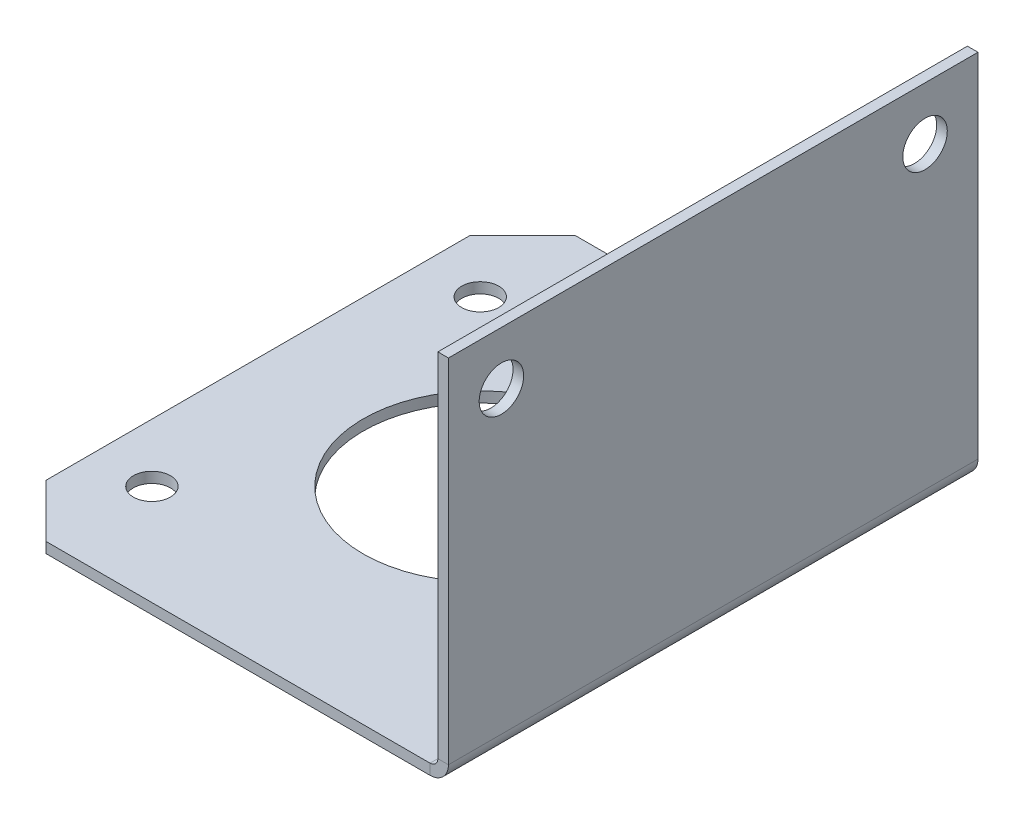
ISO-10303-21;
HEADER;
FILE_DESCRIPTION(('STEP AP214'),'2;1');
FILE_NAME('part.step','',(''),(''),'','','');
FILE_SCHEMA(('AUTOMOTIVE_DESIGN { 1 0 10303 214 1 1 1 1 }'));
ENDSEC;
DATA;
#1=APPLICATION_CONTEXT('core data for automotive mechanical design processes');
#2=APPLICATION_PROTOCOL_DEFINITION('international standard','automotive_design',2000,#1);
#3=PRODUCT_CONTEXT('',#1,'mechanical');
#4=PRODUCT('Part','Part','',(#3));
#5=PRODUCT_RELATED_PRODUCT_CATEGORY('part','',(#4));
#6=PRODUCT_DEFINITION_FORMATION('','',#4);
#7=PRODUCT_DEFINITION_CONTEXT('part definition',#1,'design');
#8=PRODUCT_DEFINITION('design','',#6,#7);
#9=PRODUCT_DEFINITION_SHAPE('','',#8);
#10=(LENGTH_UNIT() NAMED_UNIT(*) SI_UNIT(.MILLI.,.METRE.));
#11=(NAMED_UNIT(*) PLANE_ANGLE_UNIT() SI_UNIT($,.RADIAN.));
#12=(NAMED_UNIT(*) SI_UNIT($,.STERADIAN.) SOLID_ANGLE_UNIT());
#13=UNCERTAINTY_MEASURE_WITH_UNIT(LENGTH_MEASURE(1.E-05),#10,'distance_accuracy_value','');
#14=(GEOMETRIC_REPRESENTATION_CONTEXT(3) GLOBAL_UNCERTAINTY_ASSIGNED_CONTEXT((#13)) GLOBAL_UNIT_ASSIGNED_CONTEXT((#10,
#11,#12)) REPRESENTATION_CONTEXT('',''));
#15=CARTESIAN_POINT('',(0.,0.,0.));
#16=DIRECTION('',(0.,0.,1.));
#17=DIRECTION('',(1.,0.,0.));
#18=AXIS2_PLACEMENT_3D('',#15,#16,#17);
#19=CARTESIAN_POINT('',(0.,-1.,-25.));
#20=DIRECTION('',(0.,0.,-1.));
#21=DIRECTION('',(-1.,0.,0.));
#22=AXIS2_PLACEMENT_3D('',#19,#20,#21);
#23=PLANE('',#22);
#24=DIRECTION('',(-1.,0.,0.));
#25=VECTOR('',#24,1.);
#26=CARTESIAN_POINT('',(0.,-1.,-25.));
#27=LINE('',#26,#25);
#28=CARTESIAN_POINT('',(41.2634,-1.,-25.));
#29=VERTEX_POINT('',#28);
#30=CARTESIAN_POINT('',(5.,-1.,-25.));
#31=VERTEX_POINT('',#30);
#32=EDGE_CURVE('E242',#29,#31,#27,.T.);
#33=ORIENTED_EDGE('',*,*,#32,.T.);
#34=DIRECTION('',(0.,1.,0.));
#35=VECTOR('',#34,1.);
#36=CARTESIAN_POINT('',(5.,-1.,-25.));
#37=LINE('',#36,#35);
#38=CARTESIAN_POINT('',(5.,0.,-25.));
#39=VERTEX_POINT('',#38);
#40=EDGE_CURVE('E13',#31,#39,#37,.T.);
#41=ORIENTED_EDGE('',*,*,#40,.T.);
#42=DIRECTION('',(-1.,0.,0.));
#43=VECTOR('',#42,1.);
#44=CARTESIAN_POINT('',(0.,0.,-25.));
#45=LINE('',#44,#43);
#46=CARTESIAN_POINT('',(41.2634,0.,-25.));
#47=VERTEX_POINT('',#46);
#48=EDGE_CURVE('E240',#47,#39,#45,.T.);
#49=ORIENTED_EDGE('',*,*,#48,.F.);
#50=DIRECTION('',(0.,-1.,0.));
#51=VECTOR('',#50,1.);
#52=CARTESIAN_POINT('',(41.2634,0.,-25.));
#53=LINE('',#52,#51);
#54=EDGE_CURVE('E188',#47,#29,#53,.T.);
#55=ORIENTED_EDGE('',*,*,#54,.T.);
#56=EDGE_LOOP('',(#33,#41,#49,#55));
#57=FACE_BOUND('',#56,.T.);
#58=ADVANCED_FACE('F59',(#57),#23,.T.);
#59=CARTESIAN_POINT('',(0.,-1.,0.));
#60=DIRECTION('',(0.,-1.,0.));
#61=DIRECTION('',(0.,0.,-1.));
#62=AXIS2_PLACEMENT_3D('',#59,#60,#61);
#63=PLANE('',#62);
#64=CARTESIAN_POINT('',(5.5,-1.,-15.5));
#65=DIRECTION('',(0.,1.,0.));
#66=DIRECTION('',(0.,0.,1.));
#67=AXIS2_PLACEMENT_3D('',#64,#65,#66);
#68=CIRCLE('',#67,1.75);
#69=CARTESIAN_POINT('',(5.5,-1.,-13.75));
#70=VERTEX_POINT('',#69);
#71=EDGE_CURVE('E206',#70,#70,#68,.T.);
#72=ORIENTED_EDGE('',*,*,#71,.T.);
#73=EDGE_LOOP('',(#72));
#74=FACE_BOUND('',#73,.T.);
#75=CARTESIAN_POINT('',(36.5,-1.,-15.5));
#76=DIRECTION('',(0.,1.,0.));
#77=DIRECTION('',(0.,0.,1.));
#78=AXIS2_PLACEMENT_3D('',#75,#76,#77);
#79=CIRCLE('',#78,1.75);
#80=CARTESIAN_POINT('',(36.5,-1.,-13.75));
#81=VERTEX_POINT('',#80);
#82=EDGE_CURVE('E213',#81,#81,#79,.T.);
#83=ORIENTED_EDGE('',*,*,#82,.T.);
#84=EDGE_LOOP('',(#83));
#85=FACE_BOUND('',#84,.T.);
#86=CARTESIAN_POINT('',(36.5,-1.,15.5));
#87=DIRECTION('',(0.,1.,0.));
#88=DIRECTION('',(0.,0.,1.));
#89=AXIS2_PLACEMENT_3D('',#86,#87,#88);
#90=CIRCLE('',#89,1.75);
#91=CARTESIAN_POINT('',(36.5,-1.,17.25));
#92=VERTEX_POINT('',#91);
#93=EDGE_CURVE('E219',#92,#92,#90,.T.);
#94=ORIENTED_EDGE('',*,*,#93,.T.);
#95=EDGE_LOOP('',(#94));
#96=FACE_BOUND('',#95,.T.);
#97=CARTESIAN_POINT('',(5.5,-1.,15.5));
#98=DIRECTION('',(0.,1.,0.));
#99=DIRECTION('',(0.,0.,1.));
#100=AXIS2_PLACEMENT_3D('',#97,#98,#99);
#101=CIRCLE('',#100,1.75);
#102=CARTESIAN_POINT('',(5.5,-1.,17.25));
#103=VERTEX_POINT('',#102);
#104=EDGE_CURVE('E225',#103,#103,#101,.T.);
#105=ORIENTED_EDGE('',*,*,#104,.T.);
#106=EDGE_LOOP('',(#105));
#107=FACE_BOUND('',#106,.T.);
#108=CARTESIAN_POINT('',(21.,-1.,0.));
#109=DIRECTION('',(0.,1.,0.));
#110=DIRECTION('',(0.,0.,1.));
#111=AXIS2_PLACEMENT_3D('',#108,#109,#110);
#112=CIRCLE('',#111,11.05);
#113=CARTESIAN_POINT('',(21.,-1.,11.05));
#114=VERTEX_POINT('',#113);
#115=EDGE_CURVE('E230',#114,#114,#112,.T.);
#116=ORIENTED_EDGE('',*,*,#115,.T.);
#117=EDGE_LOOP('',(#116));
#118=FACE_BOUND('',#117,.T.);
#119=DIRECTION('',(1.,0.,0.));
#120=VECTOR('',#119,1.);
#121=CARTESIAN_POINT('',(0.,-1.,25.));
#122=LINE('',#121,#120);
#123=CARTESIAN_POINT('',(5.00000000000002,-1.,25.));
#124=VERTEX_POINT('',#123);
#125=CARTESIAN_POINT('',(41.2634,-1.,25.));
#126=VERTEX_POINT('',#125);
#127=EDGE_CURVE('E239',#124,#126,#122,.T.);
#128=ORIENTED_EDGE('',*,*,#127,.F.);
#129=DIRECTION('',(0.707106781186549,0.,0.707106781186546));
#130=VECTOR('',#129,1.);
#131=CARTESIAN_POINT('',(-9.99999999999999,-1.,10.));
#132=LINE('',#131,#130);
#133=CARTESIAN_POINT('',(0.,-1.,20.));
#134=VERTEX_POINT('',#133);
#135=EDGE_CURVE('E67',#124,#134,#132,.F.);
#136=ORIENTED_EDGE('',*,*,#135,.T.);
#137=DIRECTION('',(0.,0.,1.));
#138=VECTOR('',#137,1.);
#139=CARTESIAN_POINT('',(0.,-1.,25.));
#140=LINE('',#139,#138);
#141=CARTESIAN_POINT('',(0.,-1.,-20.));
#142=VERTEX_POINT('',#141);
#143=EDGE_CURVE('E236',#142,#134,#140,.T.);
#144=ORIENTED_EDGE('',*,*,#143,.F.);
#145=DIRECTION('',(-0.707106781186546,0.,0.707106781186549));
#146=VECTOR('',#145,1.);
#147=CARTESIAN_POINT('',(-9.99999999999999,-1.,-9.99999999999996));
#148=LINE('',#147,#146);
#149=EDGE_CURVE('E74',#142,#31,#148,.F.);
#150=ORIENTED_EDGE('',*,*,#149,.T.);
#151=ORIENTED_EDGE('',*,*,#32,.F.);
#152=DIRECTION('',(0.,0.,-1.));
#153=VECTOR('',#152,1.);
#154=CARTESIAN_POINT('',(41.2634,-1.,-25.));
#155=LINE('',#154,#153);
#156=EDGE_CURVE('E181',#29,#126,#155,.F.);
#157=ORIENTED_EDGE('',*,*,#156,.T.);
#158=EDGE_LOOP('',(#128,#136,#144,#150,#151,#157));
#159=FACE_BOUND('',#158,.T.);
#160=ADVANCED_FACE('F261',(#74,#85,#96,#107,#118,#159),#63,.T.);
#161=CARTESIAN_POINT('',(0.,0.,0.));
#162=DIRECTION('',(0.,-1.,0.));
#163=DIRECTION('',(0.,0.,-1.));
#164=AXIS2_PLACEMENT_3D('',#161,#162,#163);
#165=PLANE('',#164);
#166=CARTESIAN_POINT('',(21.,0.,0.));
#167=DIRECTION('',(0.,1.,0.));
#168=DIRECTION('',(0.,0.,1.));
#169=AXIS2_PLACEMENT_3D('',#166,#167,#168);
#170=CIRCLE('',#169,11.05);
#171=CARTESIAN_POINT('',(21.,0.,11.05));
#172=VERTEX_POINT('',#171);
#173=EDGE_CURVE('E209',#172,#172,#170,.T.);
#174=ORIENTED_EDGE('',*,*,#173,.F.);
#175=EDGE_LOOP('',(#174));
#176=FACE_BOUND('',#175,.T.);
#177=CARTESIAN_POINT('',(5.5,0.,15.5));
#178=DIRECTION('',(0.,1.,0.));
#179=DIRECTION('',(0.,0.,1.));
#180=AXIS2_PLACEMENT_3D('',#177,#178,#179);
#181=CIRCLE('',#180,1.75);
#182=CARTESIAN_POINT('',(5.5,0.,17.25));
#183=VERTEX_POINT('',#182);
#184=EDGE_CURVE('E203',#183,#183,#181,.T.);
#185=ORIENTED_EDGE('',*,*,#184,.F.);
#186=EDGE_LOOP('',(#185));
#187=FACE_BOUND('',#186,.T.);
#188=CARTESIAN_POINT('',(36.5,0.,15.5));
#189=DIRECTION('',(0.,1.,0.));
#190=DIRECTION('',(0.,0.,1.));
#191=AXIS2_PLACEMENT_3D('',#188,#189,#190);
#192=CIRCLE('',#191,1.75);
#193=CARTESIAN_POINT('',(36.5,0.,17.25));
#194=VERTEX_POINT('',#193);
#195=EDGE_CURVE('E222',#194,#194,#192,.T.);
#196=ORIENTED_EDGE('',*,*,#195,.F.);
#197=EDGE_LOOP('',(#196));
#198=FACE_BOUND('',#197,.T.);
#199=CARTESIAN_POINT('',(36.5,0.,-15.5));
#200=DIRECTION('',(0.,1.,0.));
#201=DIRECTION('',(0.,0.,1.));
#202=AXIS2_PLACEMENT_3D('',#199,#200,#201);
#203=CIRCLE('',#202,1.75);
#204=CARTESIAN_POINT('',(36.5,0.,-13.75));
#205=VERTEX_POINT('',#204);
#206=EDGE_CURVE('E216',#205,#205,#203,.T.);
#207=ORIENTED_EDGE('',*,*,#206,.F.);
#208=EDGE_LOOP('',(#207));
#209=FACE_BOUND('',#208,.T.);
#210=CARTESIAN_POINT('',(5.5,0.,-15.5));
#211=DIRECTION('',(0.,1.,0.));
#212=DIRECTION('',(0.,0.,1.));
#213=AXIS2_PLACEMENT_3D('',#210,#211,#212);
#214=CIRCLE('',#213,1.75);
#215=CARTESIAN_POINT('',(5.5,0.,-13.75));
#216=VERTEX_POINT('',#215);
#217=EDGE_CURVE('E210',#216,#216,#214,.T.);
#218=ORIENTED_EDGE('',*,*,#217,.F.);
#219=EDGE_LOOP('',(#218));
#220=FACE_BOUND('',#219,.T.);
#221=DIRECTION('',(0.,0.,1.));
#222=VECTOR('',#221,1.);
#223=CARTESIAN_POINT('',(0.,0.,25.));
#224=LINE('',#223,#222);
#225=CARTESIAN_POINT('',(0.,0.,-20.));
#226=VERTEX_POINT('',#225);
#227=CARTESIAN_POINT('',(0.,0.,20.));
#228=VERTEX_POINT('',#227);
#229=EDGE_CURVE('E233',#226,#228,#224,.T.);
#230=ORIENTED_EDGE('',*,*,#229,.T.);
#231=DIRECTION('',(-0.707106781186549,0.,-0.707106781186546));
#232=VECTOR('',#231,1.);
#233=CARTESIAN_POINT('',(0.,0.,20.));
#234=LINE('',#233,#232);
#235=CARTESIAN_POINT('',(5.00000000000002,0.,25.));
#236=VERTEX_POINT('',#235);
#237=EDGE_CURVE('E257',#228,#236,#234,.F.);
#238=ORIENTED_EDGE('',*,*,#237,.T.);
#239=DIRECTION('',(1.,0.,0.));
#240=VECTOR('',#239,1.);
#241=CARTESIAN_POINT('',(0.,0.,25.));
#242=LINE('',#241,#240);
#243=CARTESIAN_POINT('',(41.2634,0.,25.));
#244=VERTEX_POINT('',#243);
#245=EDGE_CURVE('E247',#236,#244,#242,.T.);
#246=ORIENTED_EDGE('',*,*,#245,.T.);
#247=DIRECTION('',(0.,0.,-1.));
#248=VECTOR('',#247,1.);
#249=CARTESIAN_POINT('',(41.2634,0.,-25.));
#250=LINE('',#249,#248);
#251=EDGE_CURVE('E194',#47,#244,#250,.F.);
#252=ORIENTED_EDGE('',*,*,#251,.F.);
#253=ORIENTED_EDGE('',*,*,#48,.T.);
#254=DIRECTION('',(0.707106781186546,0.,-0.707106781186549));
#255=VECTOR('',#254,1.);
#256=CARTESIAN_POINT('',(5.,0.,-25.));
#257=LINE('',#256,#255);
#258=EDGE_CURVE('E255',#39,#226,#257,.F.);
#259=ORIENTED_EDGE('',*,*,#258,.T.);
#260=EDGE_LOOP('',(#230,#238,#246,#252,#253,#259));
#261=FACE_BOUND('',#260,.T.);
#262=ADVANCED_FACE('F270',(#176,#187,#198,#209,#220,#261),#165,.F.);
#263=CARTESIAN_POINT('',(0.,-1.,25.));
#264=DIRECTION('',(-1.,0.,0.));
#265=DIRECTION('',(0.,0.,1.));
#266=AXIS2_PLACEMENT_3D('',#263,#264,#265);
#267=PLANE('',#266);
#268=ORIENTED_EDGE('',*,*,#143,.T.);
#269=DIRECTION('',(0.,1.,0.));
#270=VECTOR('',#269,1.);
#271=CARTESIAN_POINT('',(0.,-1.,20.));
#272=LINE('',#271,#270);
#273=EDGE_CURVE('E252',#134,#228,#272,.T.);
#274=ORIENTED_EDGE('',*,*,#273,.T.);
#275=ORIENTED_EDGE('',*,*,#229,.F.);
#276=DIRECTION('',(0.,-1.,0.));
#277=VECTOR('',#276,1.);
#278=CARTESIAN_POINT('',(0.,-1.,-20.));
#279=LINE('',#278,#277);
#280=EDGE_CURVE('E244',#226,#142,#279,.T.);
#281=ORIENTED_EDGE('',*,*,#280,.T.);
#282=EDGE_LOOP('',(#268,#274,#275,#281));
#283=FACE_BOUND('',#282,.T.);
#284=ADVANCED_FACE('F265',(#283),#267,.T.);
#285=CARTESIAN_POINT('',(0.,-1.,25.));
#286=DIRECTION('',(0.,0.,1.));
#287=DIRECTION('',(1.,0.,0.));
#288=AXIS2_PLACEMENT_3D('',#285,#286,#287);
#289=PLANE('',#288);
#290=ORIENTED_EDGE('',*,*,#245,.F.);
#291=DIRECTION('',(0.,-1.,0.));
#292=VECTOR('',#291,1.);
#293=CARTESIAN_POINT('',(5.00000000000002,-1.,25.));
#294=LINE('',#293,#292);
#295=EDGE_CURVE('E82',#236,#124,#294,.T.);
#296=ORIENTED_EDGE('',*,*,#295,.T.);
#297=ORIENTED_EDGE('',*,*,#127,.T.);
#298=DIRECTION('',(0.,-1.,0.));
#299=VECTOR('',#298,1.);
#300=CARTESIAN_POINT('',(41.2634,0.,25.));
#301=LINE('',#300,#299);
#302=EDGE_CURVE('E200',#244,#126,#301,.T.);
#303=ORIENTED_EDGE('',*,*,#302,.F.);
#304=EDGE_LOOP('',(#290,#296,#297,#303));
#305=FACE_BOUND('',#304,.T.);
#306=ADVANCED_FACE('F273',(#305),#289,.T.);
#307=CARTESIAN_POINT('',(21.,-1.,0.));
#308=DIRECTION('',(0.,1.,0.));
#309=DIRECTION('',(0.,0.,1.));
#310=AXIS2_PLACEMENT_3D('',#307,#308,#309);
#311=CYLINDRICAL_SURFACE('',#310,11.05);
#312=ORIENTED_EDGE('',*,*,#115,.F.);
#313=EDGE_LOOP('',(#312));
#314=FACE_BOUND('',#313,.T.);
#315=ORIENTED_EDGE('',*,*,#173,.T.);
#316=EDGE_LOOP('',(#315));
#317=FACE_BOUND('',#316,.T.);
#318=ADVANCED_FACE('F319',(#314,#317),#311,.F.);
#319=CARTESIAN_POINT('',(5.5,-1.,15.5));
#320=DIRECTION('',(0.,1.,0.));
#321=DIRECTION('',(0.,0.,1.));
#322=AXIS2_PLACEMENT_3D('',#319,#320,#321);
#323=CYLINDRICAL_SURFACE('',#322,1.75);
#324=ORIENTED_EDGE('',*,*,#104,.F.);
#325=EDGE_LOOP('',(#324));
#326=FACE_BOUND('',#325,.T.);
#327=ORIENTED_EDGE('',*,*,#184,.T.);
#328=EDGE_LOOP('',(#327));
#329=FACE_BOUND('',#328,.T.);
#330=ADVANCED_FACE('F497',(#326,#329),#323,.F.);
#331=CARTESIAN_POINT('',(36.5,-1.,15.5));
#332=DIRECTION('',(0.,1.,0.));
#333=DIRECTION('',(0.,0.,1.));
#334=AXIS2_PLACEMENT_3D('',#331,#332,#333);
#335=CYLINDRICAL_SURFACE('',#334,1.75);
#336=ORIENTED_EDGE('',*,*,#93,.F.);
#337=EDGE_LOOP('',(#336));
#338=FACE_BOUND('',#337,.T.);
#339=ORIENTED_EDGE('',*,*,#195,.T.);
#340=EDGE_LOOP('',(#339));
#341=FACE_BOUND('',#340,.T.);
#342=ADVANCED_FACE('F493',(#338,#341),#335,.F.);
#343=CARTESIAN_POINT('',(36.5,-1.,-15.5));
#344=DIRECTION('',(0.,1.,0.));
#345=DIRECTION('',(0.,0.,1.));
#346=AXIS2_PLACEMENT_3D('',#343,#344,#345);
#347=CYLINDRICAL_SURFACE('',#346,1.75);
#348=ORIENTED_EDGE('',*,*,#82,.F.);
#349=EDGE_LOOP('',(#348));
#350=FACE_BOUND('',#349,.T.);
#351=ORIENTED_EDGE('',*,*,#206,.T.);
#352=EDGE_LOOP('',(#351));
#353=FACE_BOUND('',#352,.T.);
#354=ADVANCED_FACE('F489',(#350,#353),#347,.F.);
#355=CARTESIAN_POINT('',(5.5,-1.,-15.5));
#356=DIRECTION('',(0.,1.,0.));
#357=DIRECTION('',(0.,0.,1.));
#358=AXIS2_PLACEMENT_3D('',#355,#356,#357);
#359=CYLINDRICAL_SURFACE('',#358,1.75);
#360=ORIENTED_EDGE('',*,*,#71,.F.);
#361=EDGE_LOOP('',(#360));
#362=FACE_BOUND('',#361,.T.);
#363=ORIENTED_EDGE('',*,*,#217,.T.);
#364=EDGE_LOOP('',(#363));
#365=FACE_BOUND('',#364,.T.);
#366=ADVANCED_FACE('F446',(#362,#365),#359,.F.);
#367=CARTESIAN_POINT('',(41.2634,0.7366,25.));
#368=DIRECTION('',(0.,0.,1.));
#369=DIRECTION('',(0.,-1.,0.));
#370=AXIS2_PLACEMENT_3D('',#367,#368,#369);
#371=PLANE('',#370);
#372=DIRECTION('',(-1.,0.,0.));
#373=VECTOR('',#372,1.);
#374=CARTESIAN_POINT('',(43.,0.736599999999993,25.));
#375=LINE('',#374,#373);
#376=CARTESIAN_POINT('',(42.,0.736599999999997,25.));
#377=VERTEX_POINT('',#376);
#378=CARTESIAN_POINT('',(43.,0.736599999999993,25.));
#379=VERTEX_POINT('',#378);
#380=EDGE_CURVE('E163',#377,#379,#375,.F.);
#381=ORIENTED_EDGE('',*,*,#380,.F.);
#382=CARTESIAN_POINT('',(41.2634,0.7366,25.));
#383=DIRECTION('',(0.,0.,-1.));
#384=DIRECTION('',(0.,1.,0.));
#385=AXIS2_PLACEMENT_3D('',#382,#383,#384);
#386=CIRCLE('',#385,0.736599999999997);
#387=EDGE_CURVE('E191',#244,#377,#386,.F.);
#388=ORIENTED_EDGE('',*,*,#387,.F.);
#389=ORIENTED_EDGE('',*,*,#302,.T.);
#390=CARTESIAN_POINT('',(41.2634,0.7366,25.));
#391=DIRECTION('',(0.,0.,-1.));
#392=DIRECTION('',(0.,1.,0.));
#393=AXIS2_PLACEMENT_3D('',#390,#391,#392);
#394=CIRCLE('',#393,1.7366);
#395=EDGE_CURVE('E184',#126,#379,#394,.F.);
#396=ORIENTED_EDGE('',*,*,#395,.T.);
#397=EDGE_LOOP('',(#381,#388,#389,#396));
#398=FACE_BOUND('',#397,.T.);
#399=ADVANCED_FACE('F277',(#398),#371,.T.);
#400=CARTESIAN_POINT('',(41.2634,0.736599999999992,-25.));
#401=DIRECTION('',(0.,0.,1.));
#402=DIRECTION('',(0.,-1.,0.));
#403=AXIS2_PLACEMENT_3D('',#400,#401,#402);
#404=PLANE('',#403);
#405=CARTESIAN_POINT('',(41.2634,0.736599999999992,-25.));
#406=DIRECTION('',(0.,0.,-1.));
#407=DIRECTION('',(0.,1.,0.));
#408=AXIS2_PLACEMENT_3D('',#405,#406,#407);
#409=CIRCLE('',#408,0.736599999999997);
#410=CARTESIAN_POINT('',(42.,0.73659999999999,-25.));
#411=VERTEX_POINT('',#410);
#412=EDGE_CURVE('E197',#411,#47,#409,.T.);
#413=ORIENTED_EDGE('',*,*,#412,.F.);
#414=DIRECTION('',(-1.,0.,0.));
#415=VECTOR('',#414,1.);
#416=CARTESIAN_POINT('',(42.,0.73659999999999,-25.));
#417=LINE('',#416,#415);
#418=CARTESIAN_POINT('',(43.,0.736599999999986,-25.));
#419=VERTEX_POINT('',#418);
#420=EDGE_CURVE('E174',#411,#419,#417,.F.);
#421=ORIENTED_EDGE('',*,*,#420,.T.);
#422=CARTESIAN_POINT('',(41.2634,0.736599999999992,-25.));
#423=DIRECTION('',(0.,0.,-1.));
#424=DIRECTION('',(0.,1.,0.));
#425=AXIS2_PLACEMENT_3D('',#422,#423,#424);
#426=CIRCLE('',#425,1.7366);
#427=EDGE_CURVE('E185',#419,#29,#426,.T.);
#428=ORIENTED_EDGE('',*,*,#427,.T.);
#429=ORIENTED_EDGE('',*,*,#54,.F.);
#430=EDGE_LOOP('',(#413,#421,#428,#429));
#431=FACE_BOUND('',#430,.T.);
#432=ADVANCED_FACE('F282',(#431),#404,.F.);
#433=CARTESIAN_POINT('',(41.2634,0.736599999999992,-25.));
#434=DIRECTION('',(0.,0.,-1.));
#435=DIRECTION('',(1.,0.,0.));
#436=AXIS2_PLACEMENT_3D('',#433,#434,#435);
#437=CYLINDRICAL_SURFACE('',#436,1.7366);
#438=ORIENTED_EDGE('',*,*,#156,.F.);
#439=ORIENTED_EDGE('',*,*,#427,.F.);
#440=DIRECTION('',(0.,0.,-1.));
#441=VECTOR('',#440,1.);
#442=CARTESIAN_POINT('',(43.,0.736599999999993,25.));
#443=LINE('',#442,#441);
#444=EDGE_CURVE('E172',#419,#379,#443,.F.);
#445=ORIENTED_EDGE('',*,*,#444,.T.);
#446=ORIENTED_EDGE('',*,*,#395,.F.);
#447=EDGE_LOOP('',(#438,#439,#445,#446));
#448=FACE_BOUND('',#447,.T.);
#449=ADVANCED_FACE('F279',(#448),#437,.T.);
#450=CARTESIAN_POINT('',(41.2634,0.736599999999992,-25.));
#451=DIRECTION('',(0.,0.,-1.));
#452=DIRECTION('',(1.,0.,0.));
#453=AXIS2_PLACEMENT_3D('',#450,#451,#452);
#454=CYLINDRICAL_SURFACE('',#453,0.736599999999997);
#455=ORIENTED_EDGE('',*,*,#251,.T.);
#456=ORIENTED_EDGE('',*,*,#387,.T.);
#457=DIRECTION('',(0.,0.,-1.));
#458=VECTOR('',#457,1.);
#459=CARTESIAN_POINT('',(42.,0.736599999999997,25.));
#460=LINE('',#459,#458);
#461=EDGE_CURVE('E177',#377,#411,#460,.T.);
#462=ORIENTED_EDGE('',*,*,#461,.T.);
#463=ORIENTED_EDGE('',*,*,#412,.T.);
#464=EDGE_LOOP('',(#455,#456,#462,#463));
#465=FACE_BOUND('',#464,.T.);
#466=ADVANCED_FACE('F288',(#465),#454,.F.);
#467=CARTESIAN_POINT('',(43.,0.,25.));
#468=DIRECTION('',(0.,0.,-1.));
#469=DIRECTION('',(0.,1.,0.));
#470=AXIS2_PLACEMENT_3D('',#467,#468,#469);
#471=PLANE('',#470);
#472=ORIENTED_EDGE('',*,*,#380,.T.);
#473=DIRECTION('',(0.,-1.,0.));
#474=VECTOR('',#473,1.);
#475=CARTESIAN_POINT('',(43.,-1.56351232339623E-13,25.));
#476=LINE('',#475,#474);
#477=CARTESIAN_POINT('',(43.0000000000001,34.,25.));
#478=VERTEX_POINT('',#477);
#479=EDGE_CURVE('E144',#478,#379,#476,.T.);
#480=ORIENTED_EDGE('',*,*,#479,.F.);
#481=DIRECTION('',(-1.,0.,0.));
#482=VECTOR('',#481,1.);
#483=CARTESIAN_POINT('',(43.0000000000001,34.,25.));
#484=LINE('',#483,#482);
#485=CARTESIAN_POINT('',(42.0000000000001,34.,25.));
#486=VERTEX_POINT('',#485);
#487=EDGE_CURVE('E150',#478,#486,#484,.T.);
#488=ORIENTED_EDGE('',*,*,#487,.T.);
#489=DIRECTION('',(0.,1.,0.));
#490=VECTOR('',#489,1.);
#491=CARTESIAN_POINT('',(42.,0.,25.));
#492=LINE('',#491,#490);
#493=EDGE_CURVE('E170',#486,#377,#492,.F.);
#494=ORIENTED_EDGE('',*,*,#493,.T.);
#495=EDGE_LOOP('',(#472,#480,#488,#494));
#496=FACE_BOUND('',#495,.T.);
#497=ADVANCED_FACE('F162',(#496),#471,.F.);
#498=CARTESIAN_POINT('',(43.0000000000001,34.,-25.));
#499=DIRECTION('',(0.,0.,1.));
#500=DIRECTION('',(0.,-1.,0.));
#501=AXIS2_PLACEMENT_3D('',#498,#499,#500);
#502=PLANE('',#501);
#503=ORIENTED_EDGE('',*,*,#420,.F.);
#504=DIRECTION('',(0.,-1.,0.));
#505=VECTOR('',#504,1.);
#506=CARTESIAN_POINT('',(42.0000000000001,34.,-25.));
#507=LINE('',#506,#505);
#508=CARTESIAN_POINT('',(42.0000000000001,34.,-25.));
#509=VERTEX_POINT('',#508);
#510=EDGE_CURVE('E166',#411,#509,#507,.F.);
#511=ORIENTED_EDGE('',*,*,#510,.T.);
#512=DIRECTION('',(-1.,0.,0.));
#513=VECTOR('',#512,1.);
#514=CARTESIAN_POINT('',(43.0000000000001,34.,-25.));
#515=LINE('',#514,#513);
#516=CARTESIAN_POINT('',(43.0000000000001,34.,-25.));
#517=VERTEX_POINT('',#516);
#518=EDGE_CURVE('E159',#517,#509,#515,.T.);
#519=ORIENTED_EDGE('',*,*,#518,.F.);
#520=DIRECTION('',(0.,1.,0.));
#521=VECTOR('',#520,1.);
#522=CARTESIAN_POINT('',(43.,-1.66555488080663E-13,-25.));
#523=LINE('',#522,#521);
#524=EDGE_CURVE('E146',#419,#517,#523,.T.);
#525=ORIENTED_EDGE('',*,*,#524,.F.);
#526=EDGE_LOOP('',(#503,#511,#519,#525));
#527=FACE_BOUND('',#526,.T.);
#528=ADVANCED_FACE('F292',(#527),#502,.F.);
#529=CARTESIAN_POINT('',(43.,-1.61453360210143E-13,0.));
#530=DIRECTION('',(-1.,0.,0.));
#531=DIRECTION('',(0.,-1.,0.));
#532=AXIS2_PLACEMENT_3D('',#529,#530,#531);
#533=PLANE('',#532);
#534=CARTESIAN_POINT('',(43.0000000000001,29.,20.));
#535=DIRECTION('',(-1.,0.,0.));
#536=DIRECTION('',(0.,-1.,0.));
#537=AXIS2_PLACEMENT_3D('',#534,#535,#536);
#538=CIRCLE('',#537,2.1);
#539=CARTESIAN_POINT('',(43.0000000000001,26.9,20.));
#540=VERTEX_POINT('',#539);
#541=EDGE_CURVE('E180',#540,#540,#538,.F.);
#542=ORIENTED_EDGE('',*,*,#541,.F.);
#543=EDGE_LOOP('',(#542));
#544=FACE_BOUND('',#543,.T.);
#545=CARTESIAN_POINT('',(43.0000000000001,29.,-20.));
#546=DIRECTION('',(-1.,0.,0.));
#547=DIRECTION('',(0.,-1.,0.));
#548=AXIS2_PLACEMENT_3D('',#545,#546,#547);
#549=CIRCLE('',#548,2.1);
#550=CARTESIAN_POINT('',(43.0000000000001,26.9,-20.));
#551=VERTEX_POINT('',#550);
#552=EDGE_CURVE('E341',#551,#551,#549,.F.);
#553=ORIENTED_EDGE('',*,*,#552,.F.);
#554=EDGE_LOOP('',(#553));
#555=FACE_BOUND('',#554,.T.);
#556=ORIENTED_EDGE('',*,*,#444,.F.);
#557=ORIENTED_EDGE('',*,*,#524,.T.);
#558=DIRECTION('',(0.,0.,1.));
#559=VECTOR('',#558,1.);
#560=CARTESIAN_POINT('',(43.0000000000001,34.,0.));
#561=LINE('',#560,#559);
#562=EDGE_CURVE('E139',#517,#478,#561,.T.);
#563=ORIENTED_EDGE('',*,*,#562,.T.);
#564=ORIENTED_EDGE('',*,*,#479,.T.);
#565=EDGE_LOOP('',(#556,#557,#563,#564));
#566=FACE_BOUND('',#565,.T.);
#567=ADVANCED_FACE('F142',(#544,#555,#566),#533,.F.);
#568=CARTESIAN_POINT('',(42.,-1.579618788713E-13,0.));
#569=DIRECTION('',(-1.,0.,0.));
#570=DIRECTION('',(0.,-1.,0.));
#571=AXIS2_PLACEMENT_3D('',#568,#569,#570);
#572=PLANE('',#571);
#573=CARTESIAN_POINT('',(42.0000000000001,29.,20.));
#574=DIRECTION('',(-1.,0.,0.));
#575=DIRECTION('',(0.,-1.,0.));
#576=AXIS2_PLACEMENT_3D('',#573,#574,#575);
#577=CIRCLE('',#576,2.1);
#578=CARTESIAN_POINT('',(42.0000000000001,26.9,20.));
#579=VERTEX_POINT('',#578);
#580=EDGE_CURVE('E337',#579,#579,#577,.T.);
#581=ORIENTED_EDGE('',*,*,#580,.F.);
#582=EDGE_LOOP('',(#581));
#583=FACE_BOUND('',#582,.T.);
#584=CARTESIAN_POINT('',(42.0000000000001,29.,-20.));
#585=DIRECTION('',(-1.,0.,0.));
#586=DIRECTION('',(0.,-1.,0.));
#587=AXIS2_PLACEMENT_3D('',#584,#585,#586);
#588=CIRCLE('',#587,2.1);
#589=CARTESIAN_POINT('',(42.0000000000001,26.9,-20.));
#590=VERTEX_POINT('',#589);
#591=EDGE_CURVE('E344',#590,#590,#588,.T.);
#592=ORIENTED_EDGE('',*,*,#591,.F.);
#593=EDGE_LOOP('',(#592));
#594=FACE_BOUND('',#593,.T.);
#595=ORIENTED_EDGE('',*,*,#510,.F.);
#596=ORIENTED_EDGE('',*,*,#461,.F.);
#597=ORIENTED_EDGE('',*,*,#493,.F.);
#598=DIRECTION('',(0.,0.,-1.));
#599=VECTOR('',#598,1.);
#600=CARTESIAN_POINT('',(42.0000000000001,34.,25.));
#601=LINE('',#600,#599);
#602=EDGE_CURVE('E155',#509,#486,#601,.F.);
#603=ORIENTED_EDGE('',*,*,#602,.F.);
#604=EDGE_LOOP('',(#595,#596,#597,#603));
#605=FACE_BOUND('',#604,.T.);
#606=ADVANCED_FACE('F294',(#583,#594,#605),#572,.T.);
#607=CARTESIAN_POINT('',(43.0000000000001,34.,25.));
#608=DIRECTION('',(0.,-1.,0.));
#609=DIRECTION('',(1.,0.,0.));
#610=AXIS2_PLACEMENT_3D('',#607,#608,#609);
#611=PLANE('',#610);
#612=ORIENTED_EDGE('',*,*,#602,.T.);
#613=ORIENTED_EDGE('',*,*,#487,.F.);
#614=ORIENTED_EDGE('',*,*,#562,.F.);
#615=ORIENTED_EDGE('',*,*,#518,.T.);
#616=EDGE_LOOP('',(#612,#613,#614,#615));
#617=FACE_BOUND('',#616,.T.);
#618=ADVANCED_FACE('F153',(#617),#611,.F.);
#619=CARTESIAN_POINT('',(43.0010000000002,29.,-20.));
#620=DIRECTION('',(-1.,0.,0.));
#621=DIRECTION('',(0.,-1.,0.));
#622=AXIS2_PLACEMENT_3D('',#619,#620,#621);
#623=CYLINDRICAL_SURFACE('',#622,2.1);
#624=ORIENTED_EDGE('',*,*,#591,.T.);
#625=EDGE_LOOP('',(#624));
#626=FACE_BOUND('',#625,.T.);
#627=ORIENTED_EDGE('',*,*,#552,.T.);
#628=EDGE_LOOP('',(#627));
#629=FACE_BOUND('',#628,.T.);
#630=ADVANCED_FACE('F302',(#626,#629),#623,.F.);
#631=CARTESIAN_POINT('',(43.0010000000002,29.,20.));
#632=DIRECTION('',(-1.,0.,0.));
#633=DIRECTION('',(0.,-1.,0.));
#634=AXIS2_PLACEMENT_3D('',#631,#632,#633);
#635=CYLINDRICAL_SURFACE('',#634,2.1);
#636=ORIENTED_EDGE('',*,*,#580,.T.);
#637=EDGE_LOOP('',(#636));
#638=FACE_BOUND('',#637,.T.);
#639=ORIENTED_EDGE('',*,*,#541,.T.);
#640=EDGE_LOOP('',(#639));
#641=FACE_BOUND('',#640,.T.);
#642=ADVANCED_FACE('F322',(#638,#641),#635,.F.);
#643=CARTESIAN_POINT('',(0.,-1.,20.));
#644=DIRECTION('',(0.707106781186546,0.,-0.707106781186549));
#645=DIRECTION('',(0.,1.,0.));
#646=AXIS2_PLACEMENT_3D('',#643,#644,#645);
#647=PLANE('',#646);
#648=ORIENTED_EDGE('',*,*,#135,.F.);
#649=ORIENTED_EDGE('',*,*,#295,.F.);
#650=ORIENTED_EDGE('',*,*,#237,.F.);
#651=ORIENTED_EDGE('',*,*,#273,.F.);
#652=EDGE_LOOP('',(#648,#649,#650,#651));
#653=FACE_BOUND('',#652,.T.);
#654=ADVANCED_FACE('F268',(#653),#647,.F.);
#655=CARTESIAN_POINT('',(5.,-1.,-25.));
#656=DIRECTION('',(0.707106781186549,0.,0.707106781186546));
#657=DIRECTION('',(0.,1.,0.));
#658=AXIS2_PLACEMENT_3D('',#655,#656,#657);
#659=PLANE('',#658);
#660=ORIENTED_EDGE('',*,*,#149,.F.);
#661=ORIENTED_EDGE('',*,*,#280,.F.);
#662=ORIENTED_EDGE('',*,*,#258,.F.);
#663=ORIENTED_EDGE('',*,*,#40,.F.);
#664=EDGE_LOOP('',(#660,#661,#662,#663));
#665=FACE_BOUND('',#664,.T.);
#666=ADVANCED_FACE('F61',(#665),#659,.F.);
#667=CLOSED_SHELL('',(#58,#160,#262,#284,#306,#318,#330,#342,#354,#366,#399,#432,#449,#466,#497,
#528,#567,#606,#618,#630,#642,#654,#666));
#668=MANIFOLD_SOLID_BREP('B2',#667);
#669=ADVANCED_BREP_SHAPE_REPRESENTATION('',(#18,#668),#14);
#670=SHAPE_DEFINITION_REPRESENTATION(#9,#669);
ENDSEC;
END-ISO-10303-21;
